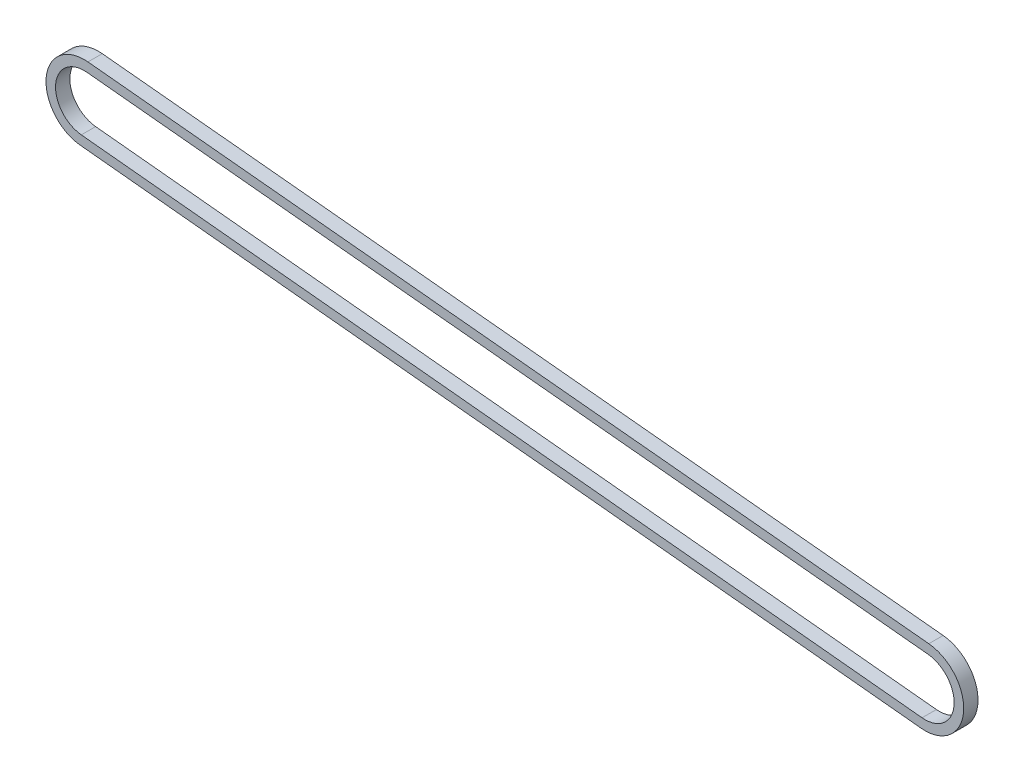
ISO-10303-21;
HEADER;
FILE_DESCRIPTION(('STEP AP214'),'2;1');
FILE_NAME('part.step','',(''),(''),'','','');
FILE_SCHEMA(('AUTOMOTIVE_DESIGN { 1 0 10303 214 1 1 1 1 }'));
ENDSEC;
DATA;
#1=APPLICATION_CONTEXT('core data for automotive mechanical design processes');
#2=APPLICATION_PROTOCOL_DEFINITION('international standard','automotive_design',2000,#1);
#3=PRODUCT_CONTEXT('',#1,'mechanical');
#4=PRODUCT('Part','Part','',(#3));
#5=PRODUCT_RELATED_PRODUCT_CATEGORY('part','',(#4));
#6=PRODUCT_DEFINITION_FORMATION('','',#4);
#7=PRODUCT_DEFINITION_CONTEXT('part definition',#1,'design');
#8=PRODUCT_DEFINITION('design','',#6,#7);
#9=PRODUCT_DEFINITION_SHAPE('','',#8);
#10=(LENGTH_UNIT() NAMED_UNIT(*) SI_UNIT(.MILLI.,.METRE.));
#11=(NAMED_UNIT(*) PLANE_ANGLE_UNIT() SI_UNIT($,.RADIAN.));
#12=(NAMED_UNIT(*) SI_UNIT($,.STERADIAN.) SOLID_ANGLE_UNIT());
#13=UNCERTAINTY_MEASURE_WITH_UNIT(LENGTH_MEASURE(1.E-05),#10,'distance_accuracy_value','');
#14=(GEOMETRIC_REPRESENTATION_CONTEXT(3) GLOBAL_UNCERTAINTY_ASSIGNED_CONTEXT((#13)) GLOBAL_UNIT_ASSIGNED_CONTEXT((#10,
#11,#12)) REPRESENTATION_CONTEXT('',''));
#15=CARTESIAN_POINT('',(0.,0.,0.));
#16=DIRECTION('',(0.,0.,1.));
#17=DIRECTION('',(1.,0.,0.));
#18=AXIS2_PLACEMENT_3D('',#15,#16,#17);
#19=CARTESIAN_POINT('',(-30.5269951282023,76.330399028484,3.));
#20=DIRECTION('',(0.,0.,-1.));
#21=DIRECTION('',(-1.,0.,0.));
#22=AXIS2_PLACEMENT_3D('',#19,#20,#21);
#23=PLANE('',#22);
#24=CARTESIAN_POINT('',(-30.5269951282023,76.330399028484,3.));
#25=DIRECTION('',(0.,0.,-1.));
#26=DIRECTION('',(-1.,0.,0.));
#27=AXIS2_PLACEMENT_3D('',#24,#25,#26);
#28=CIRCLE('',#27,8.11);
#29=CARTESIAN_POINT('',(-31.3375869941073,68.261009904955,3.));
#30=VERTEX_POINT('',#29);
#31=CARTESIAN_POINT('',(-29.7264303220622,84.4007891052505,3.));
#32=VERTEX_POINT('',#31);
#33=EDGE_CURVE('E162',#30,#32,#28,.F.);
#34=ORIENTED_EDGE('',*,*,#33,.T.);
#35=DIRECTION('',(-0.995115915754183,0.0987132929889074,0.));
#36=VECTOR('',#35,1.);
#37=CARTESIAN_POINT('',(-29.7264303220623,84.4007891052505,3.));
#38=LINE('',#37,#36);
#39=CARTESIAN_POINT('',(-205.920117096481,101.878812268188,3.));
#40=VERTEX_POINT('',#39);
#41=EDGE_CURVE('E165',#32,#40,#38,.T.);
#42=ORIENTED_EDGE('',*,*,#41,.T.);
#43=CARTESIAN_POINT('',(-206.709823440392,93.9178849421541,3.));
#44=DIRECTION('',(0.,0.,-1.));
#45=DIRECTION('',(-1.,0.,0.));
#46=AXIS2_PLACEMENT_3D('',#43,#44,#45);
#47=CIRCLE('',#46,8.);
#48=CARTESIAN_POINT('',(-207.509420842025,85.9579449929269,3.));
#49=VERTEX_POINT('',#48);
#50=EDGE_CURVE('E168',#40,#49,#47,.F.);
#51=ORIENTED_EDGE('',*,*,#50,.T.);
#52=DIRECTION('',(0.994992493653396,-0.0999496752040628,0.));
#53=VECTOR('',#52,1.);
#54=CARTESIAN_POINT('',(-31.3375869941073,68.261009904955,3.));
#55=LINE('',#54,#53);
#56=EDGE_CURVE('E170',#49,#30,#55,.T.);
#57=ORIENTED_EDGE('',*,*,#56,.T.);
#58=EDGE_LOOP('',(#34,#42,#51,#57));
#59=FACE_BOUND('',#58,.T.);
#60=CARTESIAN_POINT('',(-30.5269951282023,76.330399028484,3.));
#61=DIRECTION('',(0.,0.,1.));
#62=DIRECTION('',(-1.,0.,0.));
#63=AXIS2_PLACEMENT_3D('',#60,#61,#62);
#64=CIRCLE('',#63,6.11);
#65=CARTESIAN_POINT('',(-31.1376876436991,70.2509948922618,3.));
#66=VERTEX_POINT('',#65);
#67=CARTESIAN_POINT('',(-29.9238569080401,82.4105572737421,3.));
#68=VERTEX_POINT('',#67);
#69=EDGE_CURVE('E126',#66,#68,#64,.T.);
#70=ORIENTED_EDGE('',*,*,#69,.F.);
#71=DIRECTION('',(0.994992493653396,-0.0999496752040628,0.));
#72=VECTOR('',#71,1.);
#73=CARTESIAN_POINT('',(-31.1376876436991,70.2509948922618,3.));
#74=LINE('',#73,#72);
#75=CARTESIAN_POINT('',(-207.309521491617,87.9479299802337,3.));
#76=VERTEX_POINT('',#75);
#77=EDGE_CURVE('E148',#76,#66,#74,.T.);
#78=ORIENTED_EDGE('',*,*,#77,.F.);
#79=CARTESIAN_POINT('',(-206.709823440392,93.9178849421541,3.));
#80=DIRECTION('',(0.,0.,1.));
#81=DIRECTION('',(-1.,0.,0.));
#82=AXIS2_PLACEMENT_3D('',#79,#80,#81);
#83=CIRCLE('',#82,6.);
#84=CARTESIAN_POINT('',(-206.117543682459,99.8885804366792,3.));
#85=VERTEX_POINT('',#84);
#86=EDGE_CURVE('E146',#85,#76,#83,.T.);
#87=ORIENTED_EDGE('',*,*,#86,.F.);
#88=DIRECTION('',(-0.995115915754183,0.0987132929889074,0.));
#89=VECTOR('',#88,1.);
#90=CARTESIAN_POINT('',(-206.117543682459,99.8885804366792,3.));
#91=LINE('',#90,#89);
#92=EDGE_CURVE('E134',#68,#85,#91,.T.);
#93=ORIENTED_EDGE('',*,*,#92,.F.);
#94=EDGE_LOOP('',(#70,#78,#87,#93));
#95=FACE_BOUND('',#94,.T.);
#96=ADVANCED_FACE('F61',(#59,#95),#23,.F.);
#97=CARTESIAN_POINT('',(-30.5269951282023,76.330399028484,0.));
#98=DIRECTION('',(0.,0.,-1.));
#99=DIRECTION('',(-1.,0.,0.));
#100=AXIS2_PLACEMENT_3D('',#97,#98,#99);
#101=PLANE('',#100);
#102=CARTESIAN_POINT('',(-30.5269951282023,76.330399028484,0.));
#103=DIRECTION('',(0.,0.,-1.));
#104=DIRECTION('',(-1.,0.,0.));
#105=AXIS2_PLACEMENT_3D('',#102,#103,#104);
#106=CIRCLE('',#105,8.11);
#107=CARTESIAN_POINT('',(-31.3375869941073,68.261009904955,0.));
#108=VERTEX_POINT('',#107);
#109=CARTESIAN_POINT('',(-29.7264303220622,84.4007891052505,0.));
#110=VERTEX_POINT('',#109);
#111=EDGE_CURVE('E142',#108,#110,#106,.F.);
#112=ORIENTED_EDGE('',*,*,#111,.F.);
#113=DIRECTION('',(0.994992493653396,-0.0999496752040628,0.));
#114=VECTOR('',#113,1.);
#115=CARTESIAN_POINT('',(-31.3375869941073,68.261009904955,0.));
#116=LINE('',#115,#114);
#117=CARTESIAN_POINT('',(-207.509420842025,85.9579449929269,0.));
#118=VERTEX_POINT('',#117);
#119=EDGE_CURVE('E166',#118,#108,#116,.T.);
#120=ORIENTED_EDGE('',*,*,#119,.F.);
#121=CARTESIAN_POINT('',(-206.709823440392,93.9178849421541,0.));
#122=DIRECTION('',(0.,0.,-1.));
#123=DIRECTION('',(-1.,0.,0.));
#124=AXIS2_PLACEMENT_3D('',#121,#122,#123);
#125=CIRCLE('',#124,8.);
#126=CARTESIAN_POINT('',(-205.920117096481,101.878812268188,0.));
#127=VERTEX_POINT('',#126);
#128=EDGE_CURVE('E177',#127,#118,#125,.F.);
#129=ORIENTED_EDGE('',*,*,#128,.F.);
#130=DIRECTION('',(-0.995115915754183,0.0987132929889074,0.));
#131=VECTOR('',#130,1.);
#132=CARTESIAN_POINT('',(-29.7264303220623,84.4007891052505,0.));
#133=LINE('',#132,#131);
#134=EDGE_CURVE('E175',#110,#127,#133,.T.);
#135=ORIENTED_EDGE('',*,*,#134,.F.);
#136=EDGE_LOOP('',(#112,#120,#129,#135));
#137=FACE_BOUND('',#136,.T.);
#138=DIRECTION('',(0.994992493653396,-0.0999496752040628,0.));
#139=VECTOR('',#138,1.);
#140=CARTESIAN_POINT('',(-31.1376876436991,70.2509948922618,0.));
#141=LINE('',#140,#139);
#142=CARTESIAN_POINT('',(-207.309521491617,87.9479299802337,0.));
#143=VERTEX_POINT('',#142);
#144=CARTESIAN_POINT('',(-31.1376876436991,70.2509948922618,0.));
#145=VERTEX_POINT('',#144);
#146=EDGE_CURVE('E135',#143,#145,#141,.T.);
#147=ORIENTED_EDGE('',*,*,#146,.T.);
#148=CARTESIAN_POINT('',(-30.5269951282023,76.330399028484,0.));
#149=DIRECTION('',(0.,0.,1.));
#150=DIRECTION('',(-1.,0.,0.));
#151=AXIS2_PLACEMENT_3D('',#148,#149,#150);
#152=CIRCLE('',#151,6.11);
#153=CARTESIAN_POINT('',(-29.9238569080401,82.4105572737421,0.));
#154=VERTEX_POINT('',#153);
#155=EDGE_CURVE('E84',#145,#154,#152,.T.);
#156=ORIENTED_EDGE('',*,*,#155,.T.);
#157=DIRECTION('',(-0.995115915754183,0.0987132929889074,0.));
#158=VECTOR('',#157,1.);
#159=CARTESIAN_POINT('',(-206.117543682459,99.8885804366792,0.));
#160=LINE('',#159,#158);
#161=CARTESIAN_POINT('',(-206.117543682459,99.8885804366792,0.));
#162=VERTEX_POINT('',#161);
#163=EDGE_CURVE('E141',#154,#162,#160,.T.);
#164=ORIENTED_EDGE('',*,*,#163,.T.);
#165=CARTESIAN_POINT('',(-206.709823440392,93.9178849421541,0.));
#166=DIRECTION('',(0.,0.,1.));
#167=DIRECTION('',(-1.,0.,0.));
#168=AXIS2_PLACEMENT_3D('',#165,#166,#167);
#169=CIRCLE('',#168,6.);
#170=EDGE_CURVE('E154',#162,#143,#169,.T.);
#171=ORIENTED_EDGE('',*,*,#170,.T.);
#172=EDGE_LOOP('',(#147,#156,#164,#171));
#173=FACE_BOUND('',#172,.T.);
#174=ADVANCED_FACE('F195',(#137,#173),#101,.T.);
#175=CARTESIAN_POINT('',(-30.5269951282023,76.330399028484,3.));
#176=DIRECTION('',(0.,0.,-1.));
#177=DIRECTION('',(-1.,0.,0.));
#178=AXIS2_PLACEMENT_3D('',#175,#176,#177);
#179=CYLINDRICAL_SURFACE('',#178,8.11);
#180=ORIENTED_EDGE('',*,*,#111,.T.);
#181=DIRECTION('',(0.,0.,-1.));
#182=VECTOR('',#181,1.);
#183=CARTESIAN_POINT('',(-29.7264303220622,84.4007891052505,3.));
#184=LINE('',#183,#182);
#185=EDGE_CURVE('E12',#32,#110,#184,.T.);
#186=ORIENTED_EDGE('',*,*,#185,.F.);
#187=ORIENTED_EDGE('',*,*,#33,.F.);
#188=DIRECTION('',(0.,0.,-1.));
#189=VECTOR('',#188,1.);
#190=CARTESIAN_POINT('',(-31.3375869941073,68.261009904955,3.));
#191=LINE('',#190,#189);
#192=EDGE_CURVE('E172',#30,#108,#191,.T.);
#193=ORIENTED_EDGE('',*,*,#192,.T.);
#194=EDGE_LOOP('',(#180,#186,#187,#193));
#195=FACE_BOUND('',#194,.T.);
#196=ADVANCED_FACE('F63',(#195),#179,.T.);
#197=CARTESIAN_POINT('',(-29.7264303220623,84.4007891052505,3.));
#198=DIRECTION('',(-0.0987132929889074,-0.995115915754183,0.));
#199=DIRECTION('',(0.995115915754183,-0.0987132929889074,0.));
#200=AXIS2_PLACEMENT_3D('',#197,#198,#199);
#201=PLANE('',#200);
#202=ORIENTED_EDGE('',*,*,#134,.T.);
#203=DIRECTION('',(0.,0.,-1.));
#204=VECTOR('',#203,1.);
#205=CARTESIAN_POINT('',(-205.920117096481,101.878812268188,3.));
#206=LINE('',#205,#204);
#207=EDGE_CURVE('E69',#40,#127,#206,.T.);
#208=ORIENTED_EDGE('',*,*,#207,.F.);
#209=ORIENTED_EDGE('',*,*,#41,.F.);
#210=ORIENTED_EDGE('',*,*,#185,.T.);
#211=EDGE_LOOP('',(#202,#208,#209,#210));
#212=FACE_BOUND('',#211,.T.);
#213=ADVANCED_FACE('F205',(#212),#201,.F.);
#214=CARTESIAN_POINT('',(-206.709823440392,93.9178849421541,3.));
#215=DIRECTION('',(0.,0.,-1.));
#216=DIRECTION('',(-1.,0.,0.));
#217=AXIS2_PLACEMENT_3D('',#214,#215,#216);
#218=CYLINDRICAL_SURFACE('',#217,8.);
#219=ORIENTED_EDGE('',*,*,#128,.T.);
#220=DIRECTION('',(0.,0.,-1.));
#221=VECTOR('',#220,1.);
#222=CARTESIAN_POINT('',(-207.509420842025,85.9579449929269,3.));
#223=LINE('',#222,#221);
#224=EDGE_CURVE('E182',#49,#118,#223,.T.);
#225=ORIENTED_EDGE('',*,*,#224,.F.);
#226=ORIENTED_EDGE('',*,*,#50,.F.);
#227=ORIENTED_EDGE('',*,*,#207,.T.);
#228=EDGE_LOOP('',(#219,#225,#226,#227));
#229=FACE_BOUND('',#228,.T.);
#230=ADVANCED_FACE('F189',(#229),#218,.T.);
#231=CARTESIAN_POINT('',(-31.3375869941073,68.261009904955,3.));
#232=DIRECTION('',(0.0999496752040627,0.994992493653395,0.));
#233=DIRECTION('',(-0.994992493653396,0.0999496752040628,0.));
#234=AXIS2_PLACEMENT_3D('',#231,#232,#233);
#235=PLANE('',#234);
#236=ORIENTED_EDGE('',*,*,#119,.T.);
#237=ORIENTED_EDGE('',*,*,#192,.F.);
#238=ORIENTED_EDGE('',*,*,#56,.F.);
#239=ORIENTED_EDGE('',*,*,#224,.T.);
#240=EDGE_LOOP('',(#236,#237,#238,#239));
#241=FACE_BOUND('',#240,.T.);
#242=ADVANCED_FACE('F199',(#241),#235,.F.);
#243=CARTESIAN_POINT('',(-30.5269951282023,76.330399028484,3.));
#244=DIRECTION('',(0.,0.,-1.));
#245=DIRECTION('',(-1.,0.,0.));
#246=AXIS2_PLACEMENT_3D('',#243,#244,#245);
#247=CYLINDRICAL_SURFACE('',#246,6.11);
#248=ORIENTED_EDGE('',*,*,#155,.F.);
#249=DIRECTION('',(0.,0.,-1.));
#250=VECTOR('',#249,1.);
#251=CARTESIAN_POINT('',(-31.1376876436991,70.2509948922618,3.));
#252=LINE('',#251,#250);
#253=EDGE_CURVE('E130',#66,#145,#252,.T.);
#254=ORIENTED_EDGE('',*,*,#253,.F.);
#255=ORIENTED_EDGE('',*,*,#69,.T.);
#256=DIRECTION('',(0.,0.,-1.));
#257=VECTOR('',#256,1.);
#258=CARTESIAN_POINT('',(-29.9238569080401,82.4105572737421,3.));
#259=LINE('',#258,#257);
#260=EDGE_CURVE('E129',#68,#154,#259,.T.);
#261=ORIENTED_EDGE('',*,*,#260,.T.);
#262=EDGE_LOOP('',(#248,#254,#255,#261));
#263=FACE_BOUND('',#262,.T.);
#264=ADVANCED_FACE('F128',(#263),#247,.F.);
#265=CARTESIAN_POINT('',(-206.117543682459,99.8885804366792,3.));
#266=DIRECTION('',(-0.0987132929889074,-0.995115915754183,0.));
#267=DIRECTION('',(0.995115915754183,-0.0987132929889074,0.));
#268=AXIS2_PLACEMENT_3D('',#265,#266,#267);
#269=PLANE('',#268);
#270=ORIENTED_EDGE('',*,*,#163,.F.);
#271=ORIENTED_EDGE('',*,*,#260,.F.);
#272=ORIENTED_EDGE('',*,*,#92,.T.);
#273=DIRECTION('',(0.,0.,-1.));
#274=VECTOR('',#273,1.);
#275=CARTESIAN_POINT('',(-206.117543682459,99.8885804366792,3.));
#276=LINE('',#275,#274);
#277=EDGE_CURVE('E143',#85,#162,#276,.T.);
#278=ORIENTED_EDGE('',*,*,#277,.T.);
#279=EDGE_LOOP('',(#270,#271,#272,#278));
#280=FACE_BOUND('',#279,.T.);
#281=ADVANCED_FACE('F138',(#280),#269,.T.);
#282=CARTESIAN_POINT('',(-206.709823440392,93.9178849421541,3.));
#283=DIRECTION('',(0.,0.,-1.));
#284=DIRECTION('',(-1.,0.,0.));
#285=AXIS2_PLACEMENT_3D('',#282,#283,#284);
#286=CYLINDRICAL_SURFACE('',#285,6.);
#287=ORIENTED_EDGE('',*,*,#170,.F.);
#288=ORIENTED_EDGE('',*,*,#277,.F.);
#289=ORIENTED_EDGE('',*,*,#86,.T.);
#290=DIRECTION('',(0.,0.,-1.));
#291=VECTOR('',#290,1.);
#292=CARTESIAN_POINT('',(-207.309521491617,87.9479299802337,3.));
#293=LINE('',#292,#291);
#294=EDGE_CURVE('E76',#76,#143,#293,.T.);
#295=ORIENTED_EDGE('',*,*,#294,.T.);
#296=EDGE_LOOP('',(#287,#288,#289,#295));
#297=FACE_BOUND('',#296,.T.);
#298=ADVANCED_FACE('F228',(#297),#286,.F.);
#299=CARTESIAN_POINT('',(-31.1376876436991,70.2509948922618,3.));
#300=DIRECTION('',(0.0999496752040627,0.994992493653395,0.));
#301=DIRECTION('',(-0.994992493653396,0.0999496752040628,0.));
#302=AXIS2_PLACEMENT_3D('',#299,#300,#301);
#303=PLANE('',#302);
#304=ORIENTED_EDGE('',*,*,#146,.F.);
#305=ORIENTED_EDGE('',*,*,#294,.F.);
#306=ORIENTED_EDGE('',*,*,#77,.T.);
#307=ORIENTED_EDGE('',*,*,#253,.T.);
#308=EDGE_LOOP('',(#304,#305,#306,#307));
#309=FACE_BOUND('',#308,.T.);
#310=ADVANCED_FACE('F232',(#309),#303,.T.);
#311=CLOSED_SHELL('',(#96,#174,#196,#213,#230,#242,#264,#281,#298,#310));
#312=MANIFOLD_SOLID_BREP('B2',#311);
#313=ADVANCED_BREP_SHAPE_REPRESENTATION('',(#18,#312),#14);
#314=SHAPE_DEFINITION_REPRESENTATION(#9,#313);
ENDSEC;
END-ISO-10303-21;
